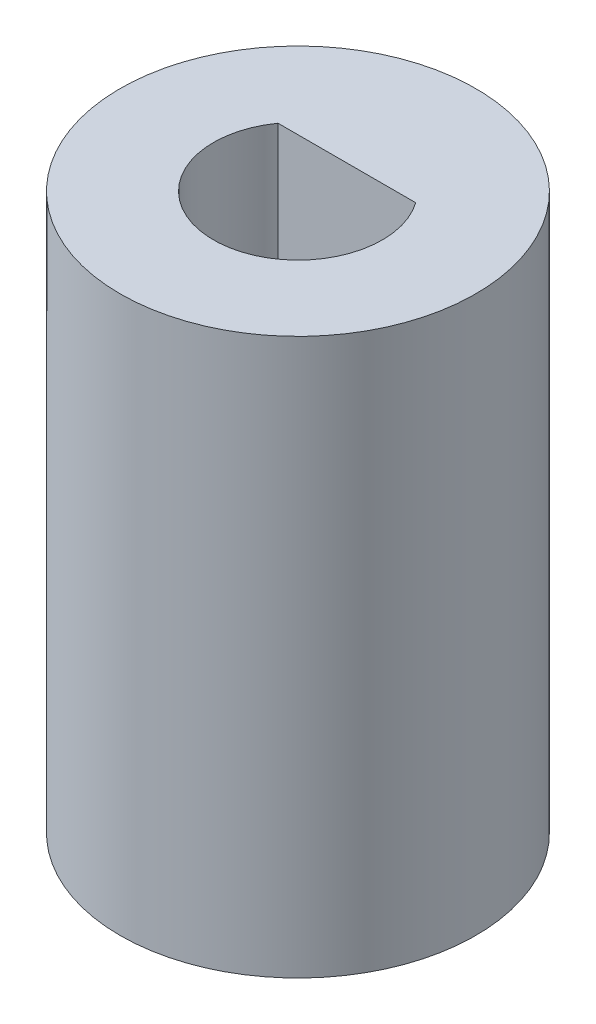
ISO-10303-21;
HEADER;
FILE_DESCRIPTION(('STEP AP214'),'2;1');
FILE_NAME('part.step','',(''),(''),'','','');
FILE_SCHEMA(('AUTOMOTIVE_DESIGN { 1 0 10303 214 1 1 1 1 }'));
ENDSEC;
DATA;
#1=APPLICATION_CONTEXT('core data for automotive mechanical design processes');
#2=APPLICATION_PROTOCOL_DEFINITION('international standard','automotive_design',2000,#1);
#3=PRODUCT_CONTEXT('',#1,'mechanical');
#4=PRODUCT('Part','Part','',(#3));
#5=PRODUCT_RELATED_PRODUCT_CATEGORY('part','',(#4));
#6=PRODUCT_DEFINITION_FORMATION('','',#4);
#7=PRODUCT_DEFINITION_CONTEXT('part definition',#1,'design');
#8=PRODUCT_DEFINITION('design','',#6,#7);
#9=PRODUCT_DEFINITION_SHAPE('','',#8);
#10=(LENGTH_UNIT() NAMED_UNIT(*) SI_UNIT(.MILLI.,.METRE.));
#11=(NAMED_UNIT(*) PLANE_ANGLE_UNIT() SI_UNIT($,.RADIAN.));
#12=(NAMED_UNIT(*) SI_UNIT($,.STERADIAN.) SOLID_ANGLE_UNIT());
#13=UNCERTAINTY_MEASURE_WITH_UNIT(LENGTH_MEASURE(1.E-05),#10,'distance_accuracy_value','');
#14=(GEOMETRIC_REPRESENTATION_CONTEXT(3) GLOBAL_UNCERTAINTY_ASSIGNED_CONTEXT((#13)) GLOBAL_UNIT_ASSIGNED_CONTEXT((#10,
#11,#12)) REPRESENTATION_CONTEXT('',''));
#15=CARTESIAN_POINT('',(0.,0.,0.));
#16=DIRECTION('',(0.,0.,1.));
#17=DIRECTION('',(1.,0.,0.));
#18=AXIS2_PLACEMENT_3D('',#15,#16,#17);
#19=CARTESIAN_POINT('',(0.,25.,0.));
#20=DIRECTION('',(0.,-1.,0.));
#21=DIRECTION('',(0.,0.,-1.));
#22=AXIS2_PLACEMENT_3D('',#19,#20,#21);
#23=CYLINDRICAL_SURFACE('',#22,3.8);
#24=CARTESIAN_POINT('',(0.,10.,0.));
#25=DIRECTION('',(0.,1.,0.));
#26=DIRECTION('',(0.,0.,1.));
#27=AXIS2_PLACEMENT_3D('',#24,#25,#26);
#28=CIRCLE('',#27,3.8);
#29=CARTESIAN_POINT('',(-3.09838667696593,10.,-2.2));
#30=VERTEX_POINT('',#29);
#31=CARTESIAN_POINT('',(3.09838667696593,10.,-2.2));
#32=VERTEX_POINT('',#31);
#33=EDGE_CURVE('E50',#30,#32,#28,.T.);
#34=ORIENTED_EDGE('',*,*,#33,.F.);
#35=DIRECTION('',(0.,-1.,0.));
#36=VECTOR('',#35,1.);
#37=CARTESIAN_POINT('',(-3.09838667696593,25.,-2.2));
#38=LINE('',#37,#36);
#39=CARTESIAN_POINT('',(-3.09838667696593,25.,-2.2));
#40=VERTEX_POINT('',#39);
#41=EDGE_CURVE('E44',#40,#30,#38,.T.);
#42=ORIENTED_EDGE('',*,*,#41,.F.);
#43=CARTESIAN_POINT('',(0.,25.,0.));
#44=DIRECTION('',(0.,1.,0.));
#45=DIRECTION('',(0.,0.,1.));
#46=AXIS2_PLACEMENT_3D('',#43,#44,#45);
#47=CIRCLE('',#46,3.8);
#48=CARTESIAN_POINT('',(3.09838667696593,25.,-2.2));
#49=VERTEX_POINT('',#48);
#50=EDGE_CURVE('E98',#40,#49,#47,.T.);
#51=ORIENTED_EDGE('',*,*,#50,.T.);
#52=DIRECTION('',(0.,-1.,0.));
#53=VECTOR('',#52,1.);
#54=CARTESIAN_POINT('',(3.09838667696593,25.,-2.2));
#55=LINE('',#54,#53);
#56=EDGE_CURVE('E106',#49,#32,#55,.T.);
#57=ORIENTED_EDGE('',*,*,#56,.T.);
#58=EDGE_LOOP('',(#34,#42,#51,#57));
#59=FACE_BOUND('',#58,.T.);
#60=ADVANCED_FACE('F37',(#59),#23,.F.);
#61=CARTESIAN_POINT('',(0.,25.,-2.2));
#62=DIRECTION('',(0.,0.,-1.));
#63=DIRECTION('',(-1.,0.,0.));
#64=AXIS2_PLACEMENT_3D('',#61,#62,#63);
#65=PLANE('',#64);
#66=ORIENTED_EDGE('',*,*,#41,.T.);
#67=DIRECTION('',(1.,0.,0.));
#68=VECTOR('',#67,1.);
#69=CARTESIAN_POINT('',(0.,10.,-2.2));
#70=LINE('',#69,#68);
#71=EDGE_CURVE('E11',#30,#32,#70,.T.);
#72=ORIENTED_EDGE('',*,*,#71,.T.);
#73=ORIENTED_EDGE('',*,*,#56,.F.);
#74=DIRECTION('',(1.,0.,0.));
#75=VECTOR('',#74,1.);
#76=CARTESIAN_POINT('',(0.,25.,-2.2));
#77=LINE('',#76,#75);
#78=EDGE_CURVE('E101',#40,#49,#77,.T.);
#79=ORIENTED_EDGE('',*,*,#78,.F.);
#80=EDGE_LOOP('',(#66,#72,#73,#79));
#81=FACE_BOUND('',#80,.T.);
#82=ADVANCED_FACE('F113',(#81),#65,.F.);
#83=CARTESIAN_POINT('',(0.,25.,0.));
#84=DIRECTION('',(0.,-1.,0.));
#85=DIRECTION('',(0.,0.,-1.));
#86=AXIS2_PLACEMENT_3D('',#83,#84,#85);
#87=CYLINDRICAL_SURFACE('',#86,8.);
#88=CARTESIAN_POINT('',(0.,25.,0.));
#89=DIRECTION('',(0.,1.,0.));
#90=DIRECTION('',(0.,0.,1.));
#91=AXIS2_PLACEMENT_3D('',#88,#89,#90);
#92=CIRCLE('',#91,8.);
#93=CARTESIAN_POINT('',(0.,25.,8.));
#94=VERTEX_POINT('',#93);
#95=EDGE_CURVE('E103',#94,#94,#92,.T.);
#96=ORIENTED_EDGE('',*,*,#95,.F.);
#97=EDGE_LOOP('',(#96));
#98=FACE_BOUND('',#97,.T.);
#99=CARTESIAN_POINT('',(0.,0.,0.));
#100=DIRECTION('',(0.,1.,0.));
#101=DIRECTION('',(0.,0.,1.));
#102=AXIS2_PLACEMENT_3D('',#99,#100,#101);
#103=CIRCLE('',#102,8.);
#104=CARTESIAN_POINT('',(0.,0.,8.));
#105=VERTEX_POINT('',#104);
#106=EDGE_CURVE('E97',#105,#105,#103,.T.);
#107=ORIENTED_EDGE('',*,*,#106,.T.);
#108=EDGE_LOOP('',(#107));
#109=FACE_BOUND('',#108,.T.);
#110=ADVANCED_FACE('F122',(#98,#109),#87,.T.);
#111=CARTESIAN_POINT('',(0.,25.,0.));
#112=DIRECTION('',(0.,1.,0.));
#113=DIRECTION('',(0.,0.,1.));
#114=AXIS2_PLACEMENT_3D('',#111,#112,#113);
#115=PLANE('',#114);
#116=ORIENTED_EDGE('',*,*,#50,.F.);
#117=ORIENTED_EDGE('',*,*,#78,.T.);
#118=EDGE_LOOP('',(#116,#117));
#119=FACE_BOUND('',#118,.T.);
#120=ORIENTED_EDGE('',*,*,#95,.T.);
#121=EDGE_LOOP('',(#120));
#122=FACE_BOUND('',#121,.T.);
#123=ADVANCED_FACE('F118',(#119,#122),#115,.T.);
#124=CARTESIAN_POINT('',(0.,0.,0.));
#125=DIRECTION('',(0.,1.,0.));
#126=DIRECTION('',(0.,0.,1.));
#127=AXIS2_PLACEMENT_3D('',#124,#125,#126);
#128=PLANE('',#127);
#129=DIRECTION('',(1.,0.,0.));
#130=VECTOR('',#129,1.);
#131=CARTESIAN_POINT('',(-2.64575131106459,0.,-3.));
#132=LINE('',#131,#130);
#133=CARTESIAN_POINT('',(-2.64575131106459,0.,-3.));
#134=VERTEX_POINT('',#133);
#135=CARTESIAN_POINT('',(2.64575131106459,0.,-3.));
#136=VERTEX_POINT('',#135);
#137=EDGE_CURVE('E88',#134,#136,#132,.T.);
#138=ORIENTED_EDGE('',*,*,#137,.F.);
#139=CARTESIAN_POINT('',(0.,0.,0.));
#140=DIRECTION('',(0.,-1.,0.));
#141=DIRECTION('',(0.,0.,1.));
#142=AXIS2_PLACEMENT_3D('',#139,#140,#141);
#143=CIRCLE('',#142,4.);
#144=EDGE_CURVE('E57',#136,#134,#143,.T.);
#145=ORIENTED_EDGE('',*,*,#144,.F.);
#146=EDGE_LOOP('',(#138,#145));
#147=FACE_BOUND('',#146,.T.);
#148=ORIENTED_EDGE('',*,*,#106,.F.);
#149=EDGE_LOOP('',(#148));
#150=FACE_BOUND('',#149,.T.);
#151=ADVANCED_FACE('F121',(#147,#150),#128,.F.);
#152=CARTESIAN_POINT('',(0.,10.,0.));
#153=DIRECTION('',(0.,-1.,0.));
#154=DIRECTION('',(0.,0.,-1.));
#155=AXIS2_PLACEMENT_3D('',#152,#153,#154);
#156=CYLINDRICAL_SURFACE('',#155,4.);
#157=ORIENTED_EDGE('',*,*,#144,.T.);
#158=DIRECTION('',(0.,-1.,0.));
#159=VECTOR('',#158,1.);
#160=CARTESIAN_POINT('',(-2.64575131106459,10.,-3.));
#161=LINE('',#160,#159);
#162=CARTESIAN_POINT('',(-2.64575131106459,10.,-3.));
#163=VERTEX_POINT('',#162);
#164=EDGE_CURVE('E74',#163,#134,#161,.T.);
#165=ORIENTED_EDGE('',*,*,#164,.F.);
#166=CARTESIAN_POINT('',(0.,10.,0.));
#167=DIRECTION('',(0.,-1.,0.));
#168=DIRECTION('',(0.,0.,1.));
#169=AXIS2_PLACEMENT_3D('',#166,#167,#168);
#170=CIRCLE('',#169,4.);
#171=CARTESIAN_POINT('',(2.64575131106459,10.,-3.));
#172=VERTEX_POINT('',#171);
#173=EDGE_CURVE('E77',#172,#163,#170,.T.);
#174=ORIENTED_EDGE('',*,*,#173,.F.);
#175=DIRECTION('',(0.,-1.,0.));
#176=VECTOR('',#175,1.);
#177=CARTESIAN_POINT('',(2.64575131106459,10.,-3.));
#178=LINE('',#177,#176);
#179=EDGE_CURVE('E83',#172,#136,#178,.T.);
#180=ORIENTED_EDGE('',*,*,#179,.T.);
#181=EDGE_LOOP('',(#157,#165,#174,#180));
#182=FACE_BOUND('',#181,.T.);
#183=ADVANCED_FACE('F76',(#182),#156,.F.);
#184=CARTESIAN_POINT('',(-2.64575131106459,10.,-3.));
#185=DIRECTION('',(0.,0.,-1.));
#186=DIRECTION('',(-1.,0.,0.));
#187=AXIS2_PLACEMENT_3D('',#184,#185,#186);
#188=PLANE('',#187);
#189=ORIENTED_EDGE('',*,*,#137,.T.);
#190=ORIENTED_EDGE('',*,*,#179,.F.);
#191=DIRECTION('',(1.,0.,0.));
#192=VECTOR('',#191,1.);
#193=CARTESIAN_POINT('',(-2.64575131106459,10.,-3.));
#194=LINE('',#193,#192);
#195=EDGE_CURVE('E84',#163,#172,#194,.T.);
#196=ORIENTED_EDGE('',*,*,#195,.F.);
#197=ORIENTED_EDGE('',*,*,#164,.T.);
#198=EDGE_LOOP('',(#189,#190,#196,#197));
#199=FACE_BOUND('',#198,.T.);
#200=ADVANCED_FACE('F90',(#199),#188,.F.);
#201=CARTESIAN_POINT('',(0.,10.,0.));
#202=DIRECTION('',(0.,1.,0.));
#203=DIRECTION('',(0.,0.,1.));
#204=AXIS2_PLACEMENT_3D('',#201,#202,#203);
#205=PLANE('',#204);
#206=ORIENTED_EDGE('',*,*,#33,.T.);
#207=ORIENTED_EDGE('',*,*,#71,.F.);
#208=EDGE_LOOP('',(#206,#207));
#209=FACE_BOUND('',#208,.T.);
#210=ORIENTED_EDGE('',*,*,#173,.T.);
#211=ORIENTED_EDGE('',*,*,#195,.T.);
#212=EDGE_LOOP('',(#210,#211));
#213=FACE_BOUND('',#212,.T.);
#214=ADVANCED_FACE('F87',(#209,#213),#205,.F.);
#215=CLOSED_SHELL('',(#60,#82,#110,#123,#151,#183,#200,#214));
#216=MANIFOLD_SOLID_BREP('B2',#215);
#217=ADVANCED_BREP_SHAPE_REPRESENTATION('',(#18,#216),#14);
#218=SHAPE_DEFINITION_REPRESENTATION(#9,#217);
ENDSEC;
END-ISO-10303-21;
